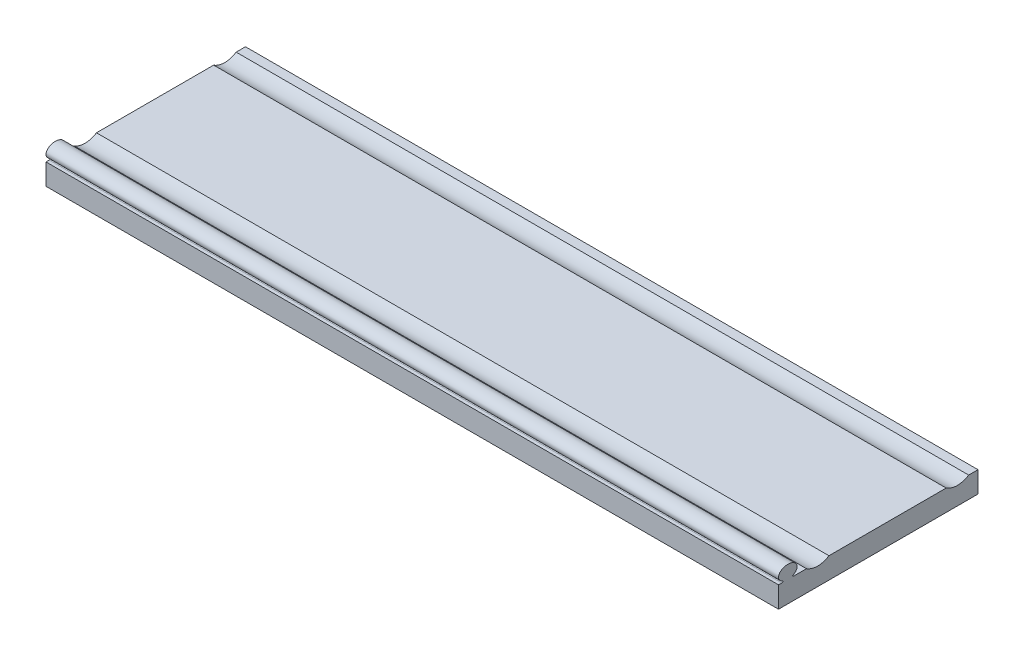
ISO-10303-21;
HEADER;
FILE_DESCRIPTION(('STEP AP214'),'2;1');
FILE_NAME('part.step','',(''),(''),'','','');
FILE_SCHEMA(('AUTOMOTIVE_DESIGN { 1 0 10303 214 1 1 1 1 }'));
ENDSEC;
DATA;
#1=APPLICATION_CONTEXT('core data for automotive mechanical design processes');
#2=APPLICATION_PROTOCOL_DEFINITION('international standard','automotive_design',2000,#1);
#3=PRODUCT_CONTEXT('',#1,'mechanical');
#4=PRODUCT('Part','Part','',(#3));
#5=PRODUCT_RELATED_PRODUCT_CATEGORY('part','',(#4));
#6=PRODUCT_DEFINITION_FORMATION('','',#4);
#7=PRODUCT_DEFINITION_CONTEXT('part definition',#1,'design');
#8=PRODUCT_DEFINITION('design','',#6,#7);
#9=PRODUCT_DEFINITION_SHAPE('','',#8);
#10=(LENGTH_UNIT() NAMED_UNIT(*) SI_UNIT(.MILLI.,.METRE.));
#11=(NAMED_UNIT(*) PLANE_ANGLE_UNIT() SI_UNIT($,.RADIAN.));
#12=(NAMED_UNIT(*) SI_UNIT($,.STERADIAN.) SOLID_ANGLE_UNIT());
#13=UNCERTAINTY_MEASURE_WITH_UNIT(LENGTH_MEASURE(1.E-05),#10,'distance_accuracy_value','');
#14=(GEOMETRIC_REPRESENTATION_CONTEXT(3) GLOBAL_UNCERTAINTY_ASSIGNED_CONTEXT((#13)) GLOBAL_UNIT_ASSIGNED_CONTEXT((#10,
#11,#12)) REPRESENTATION_CONTEXT('',''));
#15=CARTESIAN_POINT('',(0.,0.,0.));
#16=DIRECTION('',(0.,0.,1.));
#17=DIRECTION('',(1.,0.,0.));
#18=AXIS2_PLACEMENT_3D('',#15,#16,#17);
#19=CARTESIAN_POINT('',(0.,220.,0.));
#20=DIRECTION('',(-1.,0.,0.));
#21=DIRECTION('',(0.,0.,1.));
#22=AXIS2_PLACEMENT_3D('',#19,#20,#21);
#23=PLANE('',#22);
#24=DIRECTION('',(0.,0.,-1.));
#25=VECTOR('',#24,1.);
#26=CARTESIAN_POINT('',(0.,0.,0.));
#27=LINE('',#26,#25);
#28=CARTESIAN_POINT('',(2.1357288760937E-13,0.,1743.95497345085));
#29=VERTEX_POINT('',#28);
#30=CARTESIAN_POINT('',(0.,0.,-331.170414084769));
#31=VERTEX_POINT('',#30);
#32=EDGE_CURVE('E200',#29,#31,#27,.T.);
#33=ORIENTED_EDGE('',*,*,#32,.T.);
#34=DIRECTION('',(0.,1.,0.));
#35=VECTOR('',#34,1.);
#36=CARTESIAN_POINT('',(0.,220.,-331.170414084769));
#37=LINE('',#36,#35);
#38=CARTESIAN_POINT('',(0.,220.,-331.170414084769));
#39=VERTEX_POINT('',#38);
#40=EDGE_CURVE('E177',#31,#39,#37,.T.);
#41=ORIENTED_EDGE('',*,*,#40,.T.);
#42=DIRECTION('',(0.,0.,1.));
#43=VECTOR('',#42,1.);
#44=CARTESIAN_POINT('',(0.,220.,-234.068667060398));
#45=LINE('',#44,#43);
#46=CARTESIAN_POINT('',(0.,220.,-234.068667060398));
#47=VERTEX_POINT('',#46);
#48=EDGE_CURVE('E186',#39,#47,#45,.T.);
#49=ORIENTED_EDGE('',*,*,#48,.T.);
#50=CARTESIAN_POINT('',(0.,399.324359110566,-117.034333530199));
#51=DIRECTION('',(-1.,0.,0.));
#52=DIRECTION('',(0.,0.,1.));
#53=AXIS2_PLACEMENT_3D('',#50,#51,#52);
#54=CIRCLE('',#53,214.13608055457);
#55=CARTESIAN_POINT('',(0.,220.,0.));
#56=VERTEX_POINT('',#55);
#57=EDGE_CURVE('E189',#47,#56,#54,.T.);
#58=ORIENTED_EDGE('',*,*,#57,.T.);
#59=DIRECTION('',(0.,0.,-1.));
#60=VECTOR('',#59,1.);
#61=CARTESIAN_POINT('',(0.,220.,0.));
#62=LINE('',#61,#60);
#63=CARTESIAN_POINT('',(1.49308937752045E-13,220.,1219.2));
#64=VERTEX_POINT('',#63);
#65=EDGE_CURVE('E201',#64,#56,#62,.T.);
#66=ORIENTED_EDGE('',*,*,#65,.F.);
#67=CARTESIAN_POINT('',(1.63641509946856E-13,399.324359110566,1336.2343335302));
#68=DIRECTION('',(-1.,0.,0.));
#69=DIRECTION('',(0.,0.,-1.));
#70=AXIS2_PLACEMENT_3D('',#67,#68,#69);
#71=CIRCLE('',#70,214.13608055457);
#72=CARTESIAN_POINT('',(1.77974082141666E-13,220.,1453.2686670604));
#73=VERTEX_POINT('',#72);
#74=EDGE_CURVE('E127',#64,#73,#71,.T.);
#75=ORIENTED_EDGE('',*,*,#74,.T.);
#76=DIRECTION('',(0.,0.,1.));
#77=VECTOR('',#76,1.);
#78=CARTESIAN_POINT('',(1.77974082141666E-13,220.,1453.2686670604));
#79=LINE('',#78,#77);
#80=CARTESIAN_POINT('',(1.93983202090443E-13,220.,1583.99305191915));
#81=VERTEX_POINT('',#80);
#82=EDGE_CURVE('E121',#73,#81,#79,.T.);
#83=ORIENTED_EDGE('',*,*,#82,.T.);
#84=CARTESIAN_POINT('',(1.93983202090443E-13,236.617485388395,1583.99305191915));
#85=DIRECTION('',(-1.,0.,0.));
#86=DIRECTION('',(0.,0.,-1.));
#87=AXIS2_PLACEMENT_3D('',#84,#85,#86);
#88=CIRCLE('',#87,16.6174853883952);
#89=CARTESIAN_POINT('',(1.95801618555608E-13,229.156724736162,1598.84154918734));
#90=VERTEX_POINT('',#89);
#91=EDGE_CURVE('E125',#81,#90,#88,.T.);
#92=ORIENTED_EDGE('',*,*,#91,.T.);
#93=CARTESIAN_POINT('',(2.01719252059768E-13,288.575457549577,1647.16269376781));
#94=DIRECTION('',(1.,0.,0.));
#95=DIRECTION('',(0.,0.,-1.));
#96=AXIS2_PLACEMENT_3D('',#93,#94,#95);
#97=ELLIPSE('',#96,96.7922796830429,68.5754575495837);
#98=CARTESIAN_POINT('',(2.07636885563929E-13,229.156724736162,1695.48383834828));
#99=VERTEX_POINT('',#98);
#100=EDGE_CURVE('E145',#90,#99,#97,.T.);
#101=ORIENTED_EDGE('',*,*,#100,.T.);
#102=CARTESIAN_POINT('',(2.09455302029093E-13,236.617485388395,1710.33233561648));
#103=DIRECTION('',(-1.,0.,0.));
#104=DIRECTION('',(0.,0.,-1.));
#105=AXIS2_PLACEMENT_3D('',#102,#103,#104);
#106=CIRCLE('',#105,16.6174853883954);
#107=CARTESIAN_POINT('',(2.09455302029093E-13,220.,1710.33233561648));
#108=VERTEX_POINT('',#107);
#109=EDGE_CURVE('E147',#99,#108,#106,.T.);
#110=ORIENTED_EDGE('',*,*,#109,.T.);
#111=DIRECTION('',(0.,0.,1.));
#112=VECTOR('',#111,1.);
#113=CARTESIAN_POINT('',(2.09455302029093E-13,220.,1710.33233561648));
#114=LINE('',#113,#112);
#115=CARTESIAN_POINT('',(2.1357288760937E-13,220.,1743.95497345085));
#116=VERTEX_POINT('',#115);
#117=EDGE_CURVE('E155',#108,#116,#114,.T.);
#118=ORIENTED_EDGE('',*,*,#117,.T.);
#119=DIRECTION('',(0.,-1.,0.));
#120=VECTOR('',#119,1.);
#121=CARTESIAN_POINT('',(2.1357288760937E-13,220.,1743.95497345085));
#122=LINE('',#121,#120);
#123=EDGE_CURVE('E140',#116,#29,#122,.T.);
#124=ORIENTED_EDGE('',*,*,#123,.T.);
#125=EDGE_LOOP('',(#33,#41,#49,#58,#66,#75,#83,#92,#101,#110,#118,#124));
#126=FACE_BOUND('',#125,.T.);
#127=ADVANCED_FACE('F34',(#126),#23,.F.);
#128=CARTESIAN_POINT('',(-7620.,220.,0.));
#129=DIRECTION('',(1.,0.,0.));
#130=DIRECTION('',(0.,0.,-1.));
#131=AXIS2_PLACEMENT_3D('',#128,#129,#130);
#132=PLANE('',#131);
#133=DIRECTION('',(0.,0.,1.));
#134=VECTOR('',#133,1.);
#135=CARTESIAN_POINT('',(-7620.,0.,0.));
#136=LINE('',#135,#134);
#137=CARTESIAN_POINT('',(-7620.,0.,-331.170414084768));
#138=VERTEX_POINT('',#137);
#139=CARTESIAN_POINT('',(-7620.,0.,1743.95497345086));
#140=VERTEX_POINT('',#139);
#141=EDGE_CURVE('E37',#138,#140,#136,.T.);
#142=ORIENTED_EDGE('',*,*,#141,.T.);
#143=DIRECTION('',(0.,1.,0.));
#144=VECTOR('',#143,1.);
#145=CARTESIAN_POINT('',(-7620.,220.,1743.95497345086));
#146=LINE('',#145,#144);
#147=CARTESIAN_POINT('',(-7620.,220.,1743.95497345086));
#148=VERTEX_POINT('',#147);
#149=EDGE_CURVE('E173',#140,#148,#146,.T.);
#150=ORIENTED_EDGE('',*,*,#149,.T.);
#151=DIRECTION('',(0.,0.,-1.));
#152=VECTOR('',#151,1.);
#153=CARTESIAN_POINT('',(-7620.,220.,1710.33233561648));
#154=LINE('',#153,#152);
#155=CARTESIAN_POINT('',(-7620.,220.,1710.33233561648));
#156=VERTEX_POINT('',#155);
#157=EDGE_CURVE('E217',#148,#156,#154,.T.);
#158=ORIENTED_EDGE('',*,*,#157,.T.);
#159=CARTESIAN_POINT('',(-7620.,236.617485388395,1710.33233561648));
#160=DIRECTION('',(1.,0.,0.));
#161=DIRECTION('',(0.,0.,-1.));
#162=AXIS2_PLACEMENT_3D('',#159,#160,#161);
#163=CIRCLE('',#162,16.6174853883954);
#164=CARTESIAN_POINT('',(-7620.,229.156724736162,1695.48383834828));
#165=VERTEX_POINT('',#164);
#166=EDGE_CURVE('E352',#156,#165,#163,.T.);
#167=ORIENTED_EDGE('',*,*,#166,.T.);
#168=CARTESIAN_POINT('',(-7620.,288.575457549577,1647.16269376781));
#169=DIRECTION('',(1.,0.,0.));
#170=DIRECTION('',(0.,0.,-1.));
#171=AXIS2_PLACEMENT_3D('',#168,#169,#170);
#172=ELLIPSE('',#171,96.7922796830429,68.5754575495837);
#173=CARTESIAN_POINT('',(-7620.,229.156724736162,1598.84154918734));
#174=VERTEX_POINT('',#173);
#175=EDGE_CURVE('E349',#165,#174,#172,.F.);
#176=ORIENTED_EDGE('',*,*,#175,.T.);
#177=CARTESIAN_POINT('',(-7620.,236.617485388395,1583.99305191915));
#178=DIRECTION('',(1.,0.,0.));
#179=DIRECTION('',(0.,0.,-1.));
#180=AXIS2_PLACEMENT_3D('',#177,#178,#179);
#181=CIRCLE('',#180,16.6174853883952);
#182=CARTESIAN_POINT('',(-7620.,220.,1583.99305191915));
#183=VERTEX_POINT('',#182);
#184=EDGE_CURVE('E163',#174,#183,#181,.T.);
#185=ORIENTED_EDGE('',*,*,#184,.T.);
#186=DIRECTION('',(0.,0.,-1.));
#187=VECTOR('',#186,1.);
#188=CARTESIAN_POINT('',(-7620.,220.,1453.2686670604));
#189=LINE('',#188,#187);
#190=CARTESIAN_POINT('',(-7620.,220.,1453.2686670604));
#191=VERTEX_POINT('',#190);
#192=EDGE_CURVE('E135',#183,#191,#189,.T.);
#193=ORIENTED_EDGE('',*,*,#192,.T.);
#194=CARTESIAN_POINT('',(-7620.,399.324359110566,1336.2343335302));
#195=DIRECTION('',(1.,0.,0.));
#196=DIRECTION('',(0.,0.,-1.));
#197=AXIS2_PLACEMENT_3D('',#194,#195,#196);
#198=CIRCLE('',#197,214.13608055457);
#199=CARTESIAN_POINT('',(-7620.,220.,1219.2));
#200=VERTEX_POINT('',#199);
#201=EDGE_CURVE('E171',#191,#200,#198,.T.);
#202=ORIENTED_EDGE('',*,*,#201,.T.);
#203=DIRECTION('',(0.,0.,1.));
#204=VECTOR('',#203,1.);
#205=CARTESIAN_POINT('',(-7620.,220.,0.));
#206=LINE('',#205,#204);
#207=CARTESIAN_POINT('',(-7620.,220.,0.));
#208=VERTEX_POINT('',#207);
#209=EDGE_CURVE('E42',#208,#200,#206,.T.);
#210=ORIENTED_EDGE('',*,*,#209,.F.);
#211=CARTESIAN_POINT('',(-7620.,399.324359110566,-117.034333530198));
#212=DIRECTION('',(1.,0.,0.));
#213=DIRECTION('',(0.,0.,-1.));
#214=AXIS2_PLACEMENT_3D('',#211,#212,#213);
#215=CIRCLE('',#214,214.13608055457);
#216=CARTESIAN_POINT('',(-7620.,220.,-234.068667060397));
#217=VERTEX_POINT('',#216);
#218=EDGE_CURVE('E180',#208,#217,#215,.T.);
#219=ORIENTED_EDGE('',*,*,#218,.T.);
#220=DIRECTION('',(0.,0.,-1.));
#221=VECTOR('',#220,1.);
#222=CARTESIAN_POINT('',(-7620.,220.,-234.068667060397));
#223=LINE('',#222,#221);
#224=CARTESIAN_POINT('',(-7620.,220.,-331.170414084768));
#225=VERTEX_POINT('',#224);
#226=EDGE_CURVE('E178',#217,#225,#223,.T.);
#227=ORIENTED_EDGE('',*,*,#226,.T.);
#228=DIRECTION('',(0.,-1.,0.));
#229=VECTOR('',#228,1.);
#230=CARTESIAN_POINT('',(-7620.,220.,-331.170414084768));
#231=LINE('',#230,#229);
#232=EDGE_CURVE('E183',#225,#138,#231,.T.);
#233=ORIENTED_EDGE('',*,*,#232,.T.);
#234=EDGE_LOOP('',(#142,#150,#158,#167,#176,#185,#193,#202,#210,#219,#227,#233));
#235=FACE_BOUND('',#234,.T.);
#236=ADVANCED_FACE('F207',(#235),#132,.F.);
#237=CARTESIAN_POINT('',(0.,220.,0.));
#238=DIRECTION('',(0.,-1.,0.));
#239=DIRECTION('',(0.,0.,-1.));
#240=AXIS2_PLACEMENT_3D('',#237,#238,#239);
#241=PLANE('',#240);
#242=ORIENTED_EDGE('',*,*,#65,.T.);
#243=DIRECTION('',(-1.,0.,0.));
#244=VECTOR('',#243,1.);
#245=CARTESIAN_POINT('',(0.,220.,0.));
#246=LINE('',#245,#244);
#247=EDGE_CURVE('E203',#56,#208,#246,.T.);
#248=ORIENTED_EDGE('',*,*,#247,.T.);
#249=ORIENTED_EDGE('',*,*,#209,.T.);
#250=DIRECTION('',(1.,0.,0.));
#251=VECTOR('',#250,1.);
#252=CARTESIAN_POINT('',(1.49308937752045E-13,220.,1219.2));
#253=LINE('',#252,#251);
#254=EDGE_CURVE('E11',#200,#64,#253,.T.);
#255=ORIENTED_EDGE('',*,*,#254,.T.);
#256=EDGE_LOOP('',(#242,#248,#249,#255));
#257=FACE_BOUND('',#256,.T.);
#258=ADVANCED_FACE('F233',(#257),#241,.F.);
#259=CARTESIAN_POINT('',(0.,0.,0.));
#260=DIRECTION('',(0.,-1.,0.));
#261=DIRECTION('',(0.,0.,-1.));
#262=AXIS2_PLACEMENT_3D('',#259,#260,#261);
#263=PLANE('',#262);
#264=ORIENTED_EDGE('',*,*,#32,.F.);
#265=DIRECTION('',(1.,0.,0.));
#266=VECTOR('',#265,1.);
#267=CARTESIAN_POINT('',(-8026.24100947729,0.,1743.95497345086));
#268=LINE('',#267,#266);
#269=EDGE_CURVE('E160',#140,#29,#268,.T.);
#270=ORIENTED_EDGE('',*,*,#269,.F.);
#271=ORIENTED_EDGE('',*,*,#141,.F.);
#272=DIRECTION('',(1.,0.,0.));
#273=VECTOR('',#272,1.);
#274=CARTESIAN_POINT('',(-8017.58501375816,0.,-331.170414084768));
#275=LINE('',#274,#273);
#276=EDGE_CURVE('E192',#138,#31,#275,.T.);
#277=ORIENTED_EDGE('',*,*,#276,.T.);
#278=EDGE_LOOP('',(#264,#270,#271,#277));
#279=FACE_BOUND('',#278,.T.);
#280=ADVANCED_FACE('F218',(#279),#263,.T.);
#281=CARTESIAN_POINT('',(-8017.58501375816,399.324359110566,-117.034333530198));
#282=DIRECTION('',(1.,0.,0.));
#283=DIRECTION('',(0.,0.,-1.));
#284=AXIS2_PLACEMENT_3D('',#281,#282,#283);
#285=CYLINDRICAL_SURFACE('',#284,214.13608055457);
#286=ORIENTED_EDGE('',*,*,#218,.F.);
#287=ORIENTED_EDGE('',*,*,#247,.F.);
#288=ORIENTED_EDGE('',*,*,#57,.F.);
#289=DIRECTION('',(1.,0.,0.));
#290=VECTOR('',#289,1.);
#291=CARTESIAN_POINT('',(-8017.58501375816,220.,-234.068667060397));
#292=LINE('',#291,#290);
#293=EDGE_CURVE('E181',#217,#47,#292,.T.);
#294=ORIENTED_EDGE('',*,*,#293,.F.);
#295=EDGE_LOOP('',(#286,#287,#288,#294));
#296=FACE_BOUND('',#295,.T.);
#297=ADVANCED_FACE('F232',(#296),#285,.F.);
#298=CARTESIAN_POINT('',(-8017.58501375816,220.,-234.068667060397));
#299=DIRECTION('',(0.,1.,0.));
#300=DIRECTION('',(0.,0.,1.));
#301=AXIS2_PLACEMENT_3D('',#298,#299,#300);
#302=PLANE('',#301);
#303=ORIENTED_EDGE('',*,*,#226,.F.);
#304=ORIENTED_EDGE('',*,*,#293,.T.);
#305=ORIENTED_EDGE('',*,*,#48,.F.);
#306=DIRECTION('',(1.,0.,0.));
#307=VECTOR('',#306,1.);
#308=CARTESIAN_POINT('',(-8017.58501375816,220.,-331.170414084768));
#309=LINE('',#308,#307);
#310=EDGE_CURVE('E194',#225,#39,#309,.T.);
#311=ORIENTED_EDGE('',*,*,#310,.F.);
#312=EDGE_LOOP('',(#303,#304,#305,#311));
#313=FACE_BOUND('',#312,.T.);
#314=ADVANCED_FACE('F227',(#313),#302,.T.);
#315=CARTESIAN_POINT('',(-8017.58501375816,220.,-331.170414084768));
#316=DIRECTION('',(0.,0.,-1.));
#317=DIRECTION('',(-1.,0.,0.));
#318=AXIS2_PLACEMENT_3D('',#315,#316,#317);
#319=PLANE('',#318);
#320=ORIENTED_EDGE('',*,*,#232,.F.);
#321=ORIENTED_EDGE('',*,*,#310,.T.);
#322=ORIENTED_EDGE('',*,*,#40,.F.);
#323=ORIENTED_EDGE('',*,*,#276,.F.);
#324=EDGE_LOOP('',(#320,#321,#322,#323));
#325=FACE_BOUND('',#324,.T.);
#326=ADVANCED_FACE('F221',(#325),#319,.T.);
#327=CARTESIAN_POINT('',(-8017.58501375816,399.324359110566,1336.2343335302));
#328=DIRECTION('',(1.,0.,0.));
#329=DIRECTION('',(0.,0.,-1.));
#330=AXIS2_PLACEMENT_3D('',#327,#328,#329);
#331=CYLINDRICAL_SURFACE('',#330,214.13608055457);
#332=ORIENTED_EDGE('',*,*,#201,.F.);
#333=DIRECTION('',(1.,0.,0.));
#334=VECTOR('',#333,1.);
#335=CARTESIAN_POINT('',(-8017.58501375816,220.,1453.2686670604));
#336=LINE('',#335,#334);
#337=EDGE_CURVE('E130',#191,#73,#336,.T.);
#338=ORIENTED_EDGE('',*,*,#337,.T.);
#339=ORIENTED_EDGE('',*,*,#74,.F.);
#340=ORIENTED_EDGE('',*,*,#254,.F.);
#341=EDGE_LOOP('',(#332,#338,#339,#340));
#342=FACE_BOUND('',#341,.T.);
#343=ADVANCED_FACE('F236',(#342),#331,.F.);
#344=CARTESIAN_POINT('',(-8017.58501375816,220.,1453.2686670604));
#345=DIRECTION('',(0.,1.,0.));
#346=DIRECTION('',(0.,0.,1.));
#347=AXIS2_PLACEMENT_3D('',#344,#345,#346);
#348=PLANE('',#347);
#349=ORIENTED_EDGE('',*,*,#192,.F.);
#350=DIRECTION('',(1.,0.,0.));
#351=VECTOR('',#350,1.);
#352=CARTESIAN_POINT('',(-8026.24100947729,220.,1583.99305191915));
#353=LINE('',#352,#351);
#354=EDGE_CURVE('E133',#183,#81,#353,.T.);
#355=ORIENTED_EDGE('',*,*,#354,.T.);
#356=ORIENTED_EDGE('',*,*,#82,.F.);
#357=ORIENTED_EDGE('',*,*,#337,.F.);
#358=EDGE_LOOP('',(#349,#355,#356,#357));
#359=FACE_BOUND('',#358,.T.);
#360=ADVANCED_FACE('F134',(#359),#348,.T.);
#361=CARTESIAN_POINT('',(-8026.24100947729,220.,1743.95497345086));
#362=DIRECTION('',(0.,0.,1.));
#363=DIRECTION('',(1.,0.,0.));
#364=AXIS2_PLACEMENT_3D('',#361,#362,#363);
#365=PLANE('',#364);
#366=ORIENTED_EDGE('',*,*,#149,.F.);
#367=ORIENTED_EDGE('',*,*,#269,.T.);
#368=ORIENTED_EDGE('',*,*,#123,.F.);
#369=DIRECTION('',(1.,0.,0.));
#370=VECTOR('',#369,1.);
#371=CARTESIAN_POINT('',(-8026.24100947729,220.,1743.95497345086));
#372=LINE('',#371,#370);
#373=EDGE_CURVE('E164',#148,#116,#372,.T.);
#374=ORIENTED_EDGE('',*,*,#373,.F.);
#375=EDGE_LOOP('',(#366,#367,#368,#374));
#376=FACE_BOUND('',#375,.T.);
#377=ADVANCED_FACE('F215',(#376),#365,.T.);
#378=CARTESIAN_POINT('',(-8026.24100947729,220.,1710.33233561648));
#379=DIRECTION('',(0.,1.,0.));
#380=DIRECTION('',(0.,0.,1.));
#381=AXIS2_PLACEMENT_3D('',#378,#379,#380);
#382=PLANE('',#381);
#383=ORIENTED_EDGE('',*,*,#157,.F.);
#384=ORIENTED_EDGE('',*,*,#373,.T.);
#385=ORIENTED_EDGE('',*,*,#117,.F.);
#386=DIRECTION('',(1.,0.,0.));
#387=VECTOR('',#386,1.);
#388=CARTESIAN_POINT('',(-8026.24100947729,220.,1710.33233561648));
#389=LINE('',#388,#387);
#390=EDGE_CURVE('E166',#156,#108,#389,.T.);
#391=ORIENTED_EDGE('',*,*,#390,.F.);
#392=EDGE_LOOP('',(#383,#384,#385,#391));
#393=FACE_BOUND('',#392,.T.);
#394=ADVANCED_FACE('F307',(#393),#382,.T.);
#395=CARTESIAN_POINT('',(-8026.24100947729,236.617485388395,1710.33233561648));
#396=DIRECTION('',(1.,0.,0.));
#397=DIRECTION('',(0.,0.,-1.));
#398=AXIS2_PLACEMENT_3D('',#395,#396,#397);
#399=CYLINDRICAL_SURFACE('',#398,16.6174853883954);
#400=ORIENTED_EDGE('',*,*,#166,.F.);
#401=ORIENTED_EDGE('',*,*,#390,.T.);
#402=ORIENTED_EDGE('',*,*,#109,.F.);
#403=DIRECTION('',(1.,0.,0.));
#404=VECTOR('',#403,1.);
#405=CARTESIAN_POINT('',(-8026.24100947729,229.156724736162,1695.48383834828));
#406=LINE('',#405,#404);
#407=EDGE_CURVE('E168',#165,#99,#406,.T.);
#408=ORIENTED_EDGE('',*,*,#407,.F.);
#409=EDGE_LOOP('',(#400,#401,#402,#408));
#410=FACE_BOUND('',#409,.T.);
#411=ADVANCED_FACE('F316',(#410),#399,.F.);
#412=CARTESIAN_POINT('',(-8026.24100947729,288.575457549577,1647.16269376781));
#413=DIRECTION('',(1.,0.,0.));
#414=DIRECTION('',(0.,0.,-1.));
#415=AXIS2_PLACEMENT_3D('',#412,#413,#414);
#416=ELLIPSE('',#415,96.7922796830429,68.5754575495837);
#417=DIRECTION('',(1.,0.,0.));
#418=VECTOR('',#417,1.);
#419=SURFACE_OF_LINEAR_EXTRUSION('',#416,#418);
#420=ORIENTED_EDGE('',*,*,#175,.F.);
#421=ORIENTED_EDGE('',*,*,#407,.T.);
#422=ORIENTED_EDGE('',*,*,#100,.F.);
#423=DIRECTION('',(1.,0.,0.));
#424=VECTOR('',#423,1.);
#425=CARTESIAN_POINT('',(-8026.24100947729,229.156724736162,1598.84154918734));
#426=LINE('',#425,#424);
#427=EDGE_CURVE('E139',#174,#90,#426,.T.);
#428=ORIENTED_EDGE('',*,*,#427,.F.);
#429=EDGE_LOOP('',(#420,#421,#422,#428));
#430=FACE_BOUND('',#429,.T.);
#431=ADVANCED_FACE('F326',(#430),#419,.T.);
#432=CARTESIAN_POINT('',(-8026.24100947729,236.617485388395,1583.99305191915));
#433=DIRECTION('',(1.,0.,0.));
#434=DIRECTION('',(0.,0.,-1.));
#435=AXIS2_PLACEMENT_3D('',#432,#433,#434);
#436=CYLINDRICAL_SURFACE('',#435,16.6174853883952);
#437=ORIENTED_EDGE('',*,*,#184,.F.);
#438=ORIENTED_EDGE('',*,*,#427,.T.);
#439=ORIENTED_EDGE('',*,*,#91,.F.);
#440=ORIENTED_EDGE('',*,*,#354,.F.);
#441=EDGE_LOOP('',(#437,#438,#439,#440));
#442=FACE_BOUND('',#441,.T.);
#443=ADVANCED_FACE('F142',(#442),#436,.F.);
#444=CLOSED_SHELL('',(#127,#236,#258,#280,#297,#314,#326,#343,#360,#377,#394,#411,#431,#443));
#445=MANIFOLD_SOLID_BREP('B2',#444);
#446=ADVANCED_BREP_SHAPE_REPRESENTATION('',(#18,#445),#14);
#447=SHAPE_DEFINITION_REPRESENTATION(#9,#446);
ENDSEC;
END-ISO-10303-21;
